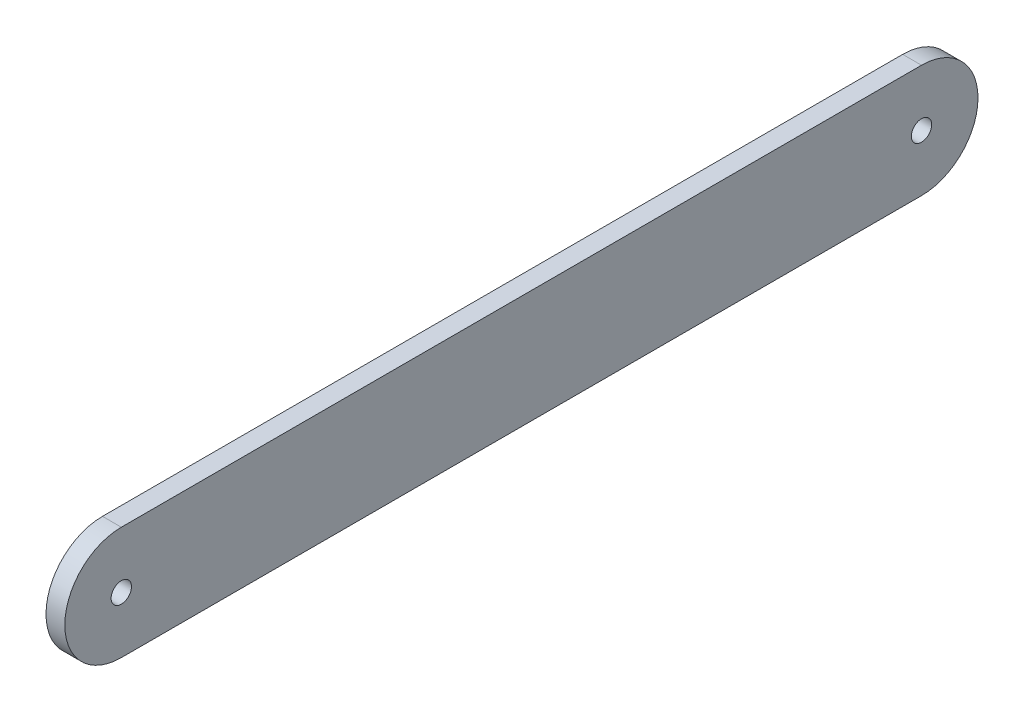
ISO-10303-21;
HEADER;
FILE_DESCRIPTION(('STEP AP214'),'2;1');
FILE_NAME('part.step','',(''),(''),'','','');
FILE_SCHEMA(('AUTOMOTIVE_DESIGN { 1 0 10303 214 1 1 1 1 }'));
ENDSEC;
DATA;
#1=APPLICATION_CONTEXT('core data for automotive mechanical design processes');
#2=APPLICATION_PROTOCOL_DEFINITION('international standard','automotive_design',2000,#1);
#3=PRODUCT_CONTEXT('',#1,'mechanical');
#4=PRODUCT('Part','Part','',(#3));
#5=PRODUCT_RELATED_PRODUCT_CATEGORY('part','',(#4));
#6=PRODUCT_DEFINITION_FORMATION('','',#4);
#7=PRODUCT_DEFINITION_CONTEXT('part definition',#1,'design');
#8=PRODUCT_DEFINITION('design','',#6,#7);
#9=PRODUCT_DEFINITION_SHAPE('','',#8);
#10=(LENGTH_UNIT() NAMED_UNIT(*) SI_UNIT(.MILLI.,.METRE.));
#11=(NAMED_UNIT(*) PLANE_ANGLE_UNIT() SI_UNIT($,.RADIAN.));
#12=(NAMED_UNIT(*) SI_UNIT($,.STERADIAN.) SOLID_ANGLE_UNIT());
#13=UNCERTAINTY_MEASURE_WITH_UNIT(LENGTH_MEASURE(1.E-05),#10,'distance_accuracy_value','');
#14=(GEOMETRIC_REPRESENTATION_CONTEXT(3) GLOBAL_UNCERTAINTY_ASSIGNED_CONTEXT((#13)) GLOBAL_UNIT_ASSIGNED_CONTEXT((#10,
#11,#12)) REPRESENTATION_CONTEXT('',''));
#15=CARTESIAN_POINT('',(0.,0.,0.));
#16=DIRECTION('',(0.,0.,1.));
#17=DIRECTION('',(1.,0.,0.));
#18=AXIS2_PLACEMENT_3D('',#15,#16,#17);
#19=CARTESIAN_POINT('',(5.,0.,-106.25));
#20=DIRECTION('',(1.,0.,0.));
#21=DIRECTION('',(0.,0.,-1.));
#22=AXIS2_PLACEMENT_3D('',#19,#20,#21);
#23=PLANE('',#22);
#24=CARTESIAN_POINT('',(5.,0.,106.25));
#25=DIRECTION('',(1.,0.,0.));
#26=DIRECTION('',(0.,0.,-1.));
#27=AXIS2_PLACEMENT_3D('',#24,#25,#26);
#28=CIRCLE('',#27,2.7);
#29=CARTESIAN_POINT('',(5.,0.,103.55));
#30=VERTEX_POINT('',#29);
#31=EDGE_CURVE('E118',#30,#30,#28,.T.);
#32=ORIENTED_EDGE('',*,*,#31,.F.);
#33=EDGE_LOOP('',(#32));
#34=FACE_BOUND('',#33,.T.);
#35=CARTESIAN_POINT('',(5.,0.,-106.25));
#36=DIRECTION('',(1.,0.,0.));
#37=DIRECTION('',(0.,0.,-1.));
#38=AXIS2_PLACEMENT_3D('',#35,#36,#37);
#39=CIRCLE('',#38,15.);
#40=CARTESIAN_POINT('',(5.,-15.,-106.25));
#41=VERTEX_POINT('',#40);
#42=CARTESIAN_POINT('',(5.,15.,-106.25));
#43=VERTEX_POINT('',#42);
#44=EDGE_CURVE('E98',#41,#43,#39,.T.);
#45=ORIENTED_EDGE('',*,*,#44,.T.);
#46=DIRECTION('',(0.,0.,1.));
#47=VECTOR('',#46,1.);
#48=CARTESIAN_POINT('',(5.,15.,106.25));
#49=LINE('',#48,#47);
#50=CARTESIAN_POINT('',(5.,15.,106.25));
#51=VERTEX_POINT('',#50);
#52=EDGE_CURVE('E93',#43,#51,#49,.T.);
#53=ORIENTED_EDGE('',*,*,#52,.T.);
#54=CARTESIAN_POINT('',(5.,0.,106.25));
#55=DIRECTION('',(1.,0.,0.));
#56=DIRECTION('',(0.,0.,-1.));
#57=AXIS2_PLACEMENT_3D('',#54,#55,#56);
#58=CIRCLE('',#57,15.);
#59=CARTESIAN_POINT('',(5.,-15.,106.25));
#60=VERTEX_POINT('',#59);
#61=EDGE_CURVE('E96',#51,#60,#58,.T.);
#62=ORIENTED_EDGE('',*,*,#61,.T.);
#63=DIRECTION('',(0.,0.,-1.));
#64=VECTOR('',#63,1.);
#65=CARTESIAN_POINT('',(5.,-15.,106.25));
#66=LINE('',#65,#64);
#67=EDGE_CURVE('E63',#60,#41,#66,.T.);
#68=ORIENTED_EDGE('',*,*,#67,.T.);
#69=EDGE_LOOP('',(#45,#53,#62,#68));
#70=FACE_BOUND('',#69,.T.);
#71=CARTESIAN_POINT('',(5.,0.,-106.25));
#72=DIRECTION('',(1.,0.,0.));
#73=DIRECTION('',(0.,0.,-1.));
#74=AXIS2_PLACEMENT_3D('',#71,#72,#73);
#75=CIRCLE('',#74,2.7);
#76=CARTESIAN_POINT('',(5.,0.,-108.95));
#77=VERTEX_POINT('',#76);
#78=EDGE_CURVE('E140',#77,#77,#75,.T.);
#79=ORIENTED_EDGE('',*,*,#78,.F.);
#80=EDGE_LOOP('',(#79));
#81=FACE_BOUND('',#80,.T.);
#82=ADVANCED_FACE('F45',(#34,#70,#81),#23,.T.);
#83=CARTESIAN_POINT('',(0.,0.,-106.25));
#84=DIRECTION('',(1.,0.,0.));
#85=DIRECTION('',(0.,0.,-1.));
#86=AXIS2_PLACEMENT_3D('',#83,#84,#85);
#87=PLANE('',#86);
#88=CARTESIAN_POINT('',(0.,0.,-106.25));
#89=DIRECTION('',(1.,0.,0.));
#90=DIRECTION('',(0.,0.,-1.));
#91=AXIS2_PLACEMENT_3D('',#88,#89,#90);
#92=CIRCLE('',#91,15.);
#93=CARTESIAN_POINT('',(0.,-15.,-106.25));
#94=VERTEX_POINT('',#93);
#95=CARTESIAN_POINT('',(0.,15.,-106.25));
#96=VERTEX_POINT('',#95);
#97=EDGE_CURVE('E114',#94,#96,#92,.T.);
#98=ORIENTED_EDGE('',*,*,#97,.F.);
#99=DIRECTION('',(0.,0.,-1.));
#100=VECTOR('',#99,1.);
#101=CARTESIAN_POINT('',(0.,-15.,106.25));
#102=LINE('',#101,#100);
#103=CARTESIAN_POINT('',(0.,-15.,106.25));
#104=VERTEX_POINT('',#103);
#105=EDGE_CURVE('E86',#104,#94,#102,.T.);
#106=ORIENTED_EDGE('',*,*,#105,.F.);
#107=CARTESIAN_POINT('',(0.,0.,106.25));
#108=DIRECTION('',(1.,0.,0.));
#109=DIRECTION('',(0.,0.,-1.));
#110=AXIS2_PLACEMENT_3D('',#107,#108,#109);
#111=CIRCLE('',#110,15.);
#112=CARTESIAN_POINT('',(0.,15.,106.25));
#113=VERTEX_POINT('',#112);
#114=EDGE_CURVE('E80',#113,#104,#111,.T.);
#115=ORIENTED_EDGE('',*,*,#114,.F.);
#116=DIRECTION('',(0.,0.,1.));
#117=VECTOR('',#116,1.);
#118=CARTESIAN_POINT('',(0.,15.,106.25));
#119=LINE('',#118,#117);
#120=EDGE_CURVE('E103',#96,#113,#119,.T.);
#121=ORIENTED_EDGE('',*,*,#120,.F.);
#122=EDGE_LOOP('',(#98,#106,#115,#121));
#123=FACE_BOUND('',#122,.T.);
#124=CARTESIAN_POINT('',(0.,0.,106.25));
#125=DIRECTION('',(1.,0.,0.));
#126=DIRECTION('',(0.,0.,-1.));
#127=AXIS2_PLACEMENT_3D('',#124,#125,#126);
#128=CIRCLE('',#127,2.7);
#129=CARTESIAN_POINT('',(0.,0.,103.55));
#130=VERTEX_POINT('',#129);
#131=EDGE_CURVE('E136',#130,#130,#128,.T.);
#132=ORIENTED_EDGE('',*,*,#131,.T.);
#133=EDGE_LOOP('',(#132));
#134=FACE_BOUND('',#133,.T.);
#135=CARTESIAN_POINT('',(0.,0.,-106.25));
#136=DIRECTION('',(1.,0.,0.));
#137=DIRECTION('',(0.,0.,-1.));
#138=AXIS2_PLACEMENT_3D('',#135,#136,#137);
#139=CIRCLE('',#138,2.7);
#140=CARTESIAN_POINT('',(0.,0.,-108.95));
#141=VERTEX_POINT('',#140);
#142=EDGE_CURVE('E144',#141,#141,#139,.T.);
#143=ORIENTED_EDGE('',*,*,#142,.T.);
#144=EDGE_LOOP('',(#143));
#145=FACE_BOUND('',#144,.T.);
#146=ADVANCED_FACE('F131',(#123,#134,#145),#87,.F.);
#147=CARTESIAN_POINT('',(5.,0.,-106.25));
#148=DIRECTION('',(-1.,0.,0.));
#149=DIRECTION('',(0.,0.,1.));
#150=AXIS2_PLACEMENT_3D('',#147,#148,#149);
#151=CYLINDRICAL_SURFACE('',#150,15.);
#152=ORIENTED_EDGE('',*,*,#97,.T.);
#153=DIRECTION('',(-1.,0.,0.));
#154=VECTOR('',#153,1.);
#155=CARTESIAN_POINT('',(5.,15.,-106.25));
#156=LINE('',#155,#154);
#157=EDGE_CURVE('E11',#43,#96,#156,.T.);
#158=ORIENTED_EDGE('',*,*,#157,.F.);
#159=ORIENTED_EDGE('',*,*,#44,.F.);
#160=DIRECTION('',(-1.,0.,0.));
#161=VECTOR('',#160,1.);
#162=CARTESIAN_POINT('',(5.,-15.,-106.25));
#163=LINE('',#162,#161);
#164=EDGE_CURVE('E110',#41,#94,#163,.T.);
#165=ORIENTED_EDGE('',*,*,#164,.T.);
#166=EDGE_LOOP('',(#152,#158,#159,#165));
#167=FACE_BOUND('',#166,.T.);
#168=ADVANCED_FACE('F47',(#167),#151,.T.);
#169=CARTESIAN_POINT('',(5.,15.,106.25));
#170=DIRECTION('',(0.,-1.,0.));
#171=DIRECTION('',(0.,0.,-1.));
#172=AXIS2_PLACEMENT_3D('',#169,#170,#171);
#173=PLANE('',#172);
#174=ORIENTED_EDGE('',*,*,#120,.T.);
#175=DIRECTION('',(-1.,0.,0.));
#176=VECTOR('',#175,1.);
#177=CARTESIAN_POINT('',(5.,15.,106.25));
#178=LINE('',#177,#176);
#179=EDGE_CURVE('E55',#51,#113,#178,.T.);
#180=ORIENTED_EDGE('',*,*,#179,.F.);
#181=ORIENTED_EDGE('',*,*,#52,.F.);
#182=ORIENTED_EDGE('',*,*,#157,.T.);
#183=EDGE_LOOP('',(#174,#180,#181,#182));
#184=FACE_BOUND('',#183,.T.);
#185=ADVANCED_FACE('F102',(#184),#173,.F.);
#186=CARTESIAN_POINT('',(5.,0.,106.25));
#187=DIRECTION('',(-1.,0.,0.));
#188=DIRECTION('',(0.,0.,1.));
#189=AXIS2_PLACEMENT_3D('',#186,#187,#188);
#190=CYLINDRICAL_SURFACE('',#189,15.);
#191=ORIENTED_EDGE('',*,*,#114,.T.);
#192=DIRECTION('',(-1.,0.,0.));
#193=VECTOR('',#192,1.);
#194=CARTESIAN_POINT('',(5.,-15.,106.25));
#195=LINE('',#194,#193);
#196=EDGE_CURVE('E105',#60,#104,#195,.T.);
#197=ORIENTED_EDGE('',*,*,#196,.F.);
#198=ORIENTED_EDGE('',*,*,#61,.F.);
#199=ORIENTED_EDGE('',*,*,#179,.T.);
#200=EDGE_LOOP('',(#191,#197,#198,#199));
#201=FACE_BOUND('',#200,.T.);
#202=ADVANCED_FACE('F106',(#201),#190,.T.);
#203=CARTESIAN_POINT('',(5.,-15.,106.25));
#204=DIRECTION('',(0.,1.,0.));
#205=DIRECTION('',(0.,0.,1.));
#206=AXIS2_PLACEMENT_3D('',#203,#204,#205);
#207=PLANE('',#206);
#208=ORIENTED_EDGE('',*,*,#105,.T.);
#209=ORIENTED_EDGE('',*,*,#164,.F.);
#210=ORIENTED_EDGE('',*,*,#67,.F.);
#211=ORIENTED_EDGE('',*,*,#196,.T.);
#212=EDGE_LOOP('',(#208,#209,#210,#211));
#213=FACE_BOUND('',#212,.T.);
#214=ADVANCED_FACE('F128',(#213),#207,.F.);
#215=CARTESIAN_POINT('',(5.,0.,106.25));
#216=DIRECTION('',(-1.,0.,0.));
#217=DIRECTION('',(0.,0.,1.));
#218=AXIS2_PLACEMENT_3D('',#215,#216,#217);
#219=CYLINDRICAL_SURFACE('',#218,2.7);
#220=ORIENTED_EDGE('',*,*,#31,.T.);
#221=EDGE_LOOP('',(#220));
#222=FACE_BOUND('',#221,.T.);
#223=ORIENTED_EDGE('',*,*,#131,.F.);
#224=EDGE_LOOP('',(#223));
#225=FACE_BOUND('',#224,.T.);
#226=ADVANCED_FACE('F163',(#222,#225),#219,.F.);
#227=CARTESIAN_POINT('',(5.,0.,-106.25));
#228=DIRECTION('',(-1.,0.,0.));
#229=DIRECTION('',(0.,0.,1.));
#230=AXIS2_PLACEMENT_3D('',#227,#228,#229);
#231=CYLINDRICAL_SURFACE('',#230,2.7);
#232=ORIENTED_EDGE('',*,*,#78,.T.);
#233=EDGE_LOOP('',(#232));
#234=FACE_BOUND('',#233,.T.);
#235=ORIENTED_EDGE('',*,*,#142,.F.);
#236=EDGE_LOOP('',(#235));
#237=FACE_BOUND('',#236,.T.);
#238=ADVANCED_FACE('F152',(#234,#237),#231,.F.);
#239=CLOSED_SHELL('',(#82,#146,#168,#185,#202,#214,#226,#238));
#240=MANIFOLD_SOLID_BREP('B2',#239);
#241=ADVANCED_BREP_SHAPE_REPRESENTATION('',(#18,#240),#14);
#242=SHAPE_DEFINITION_REPRESENTATION(#9,#241);
ENDSEC;
END-ISO-10303-21;
